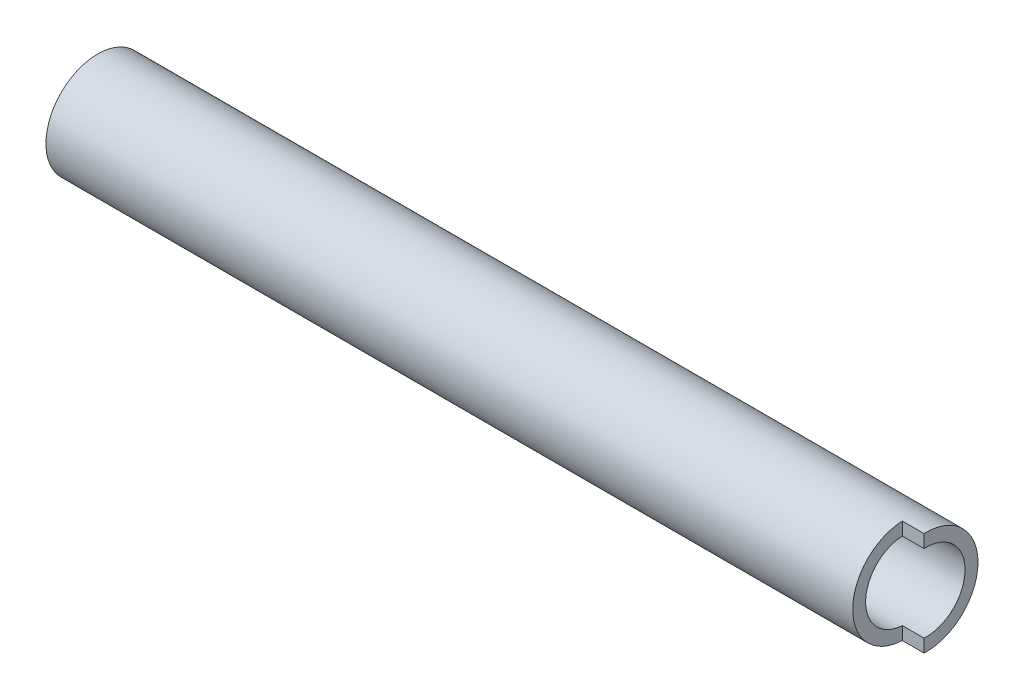
ISO-10303-21;
HEADER;
FILE_DESCRIPTION(('STEP AP214'),'2;1');
FILE_NAME('part.step','',(''),(''),'','','');
FILE_SCHEMA(('AUTOMOTIVE_DESIGN { 1 0 10303 214 1 1 1 1 }'));
ENDSEC;
DATA;
#1=APPLICATION_CONTEXT('core data for automotive mechanical design processes');
#2=APPLICATION_PROTOCOL_DEFINITION('international standard','automotive_design',2000,#1);
#3=PRODUCT_CONTEXT('',#1,'mechanical');
#4=PRODUCT('Part','Part','',(#3));
#5=PRODUCT_RELATED_PRODUCT_CATEGORY('part','',(#4));
#6=PRODUCT_DEFINITION_FORMATION('','',#4);
#7=PRODUCT_DEFINITION_CONTEXT('part definition',#1,'design');
#8=PRODUCT_DEFINITION('design','',#6,#7);
#9=PRODUCT_DEFINITION_SHAPE('','',#8);
#10=(LENGTH_UNIT() NAMED_UNIT(*) SI_UNIT(.MILLI.,.METRE.));
#11=(NAMED_UNIT(*) PLANE_ANGLE_UNIT() SI_UNIT($,.RADIAN.));
#12=(NAMED_UNIT(*) SI_UNIT($,.STERADIAN.) SOLID_ANGLE_UNIT());
#13=UNCERTAINTY_MEASURE_WITH_UNIT(LENGTH_MEASURE(1.E-05),#10,'distance_accuracy_value','');
#14=(GEOMETRIC_REPRESENTATION_CONTEXT(3) GLOBAL_UNCERTAINTY_ASSIGNED_CONTEXT((#13)) GLOBAL_UNIT_ASSIGNED_CONTEXT((#10,
#11,#12)) REPRESENTATION_CONTEXT('',''));
#15=CARTESIAN_POINT('',(0.,0.,0.));
#16=DIRECTION('',(0.,0.,1.));
#17=DIRECTION('',(1.,0.,0.));
#18=AXIS2_PLACEMENT_3D('',#15,#16,#17);
#19=CARTESIAN_POINT('',(38.1,0.,0.));
#20=DIRECTION('',(1.,0.,0.));
#21=DIRECTION('',(0.,0.,-1.));
#22=AXIS2_PLACEMENT_3D('',#19,#20,#21);
#23=PLANE('',#22);
#24=DIRECTION('',(0.,1.,0.));
#25=VECTOR('',#24,1.);
#26=CARTESIAN_POINT('',(38.1,0.,0.201999999993971));
#27=LINE('',#26,#25);
#28=CARTESIAN_POINT('',(38.1,-4.75821418706666,0.201999999993971));
#29=VERTEX_POINT('',#28);
#30=CARTESIAN_POINT('',(38.1,-3.56615857970834,0.201999999993971));
#31=VERTEX_POINT('',#30);
#32=EDGE_CURVE('E84',#29,#31,#27,.T.);
#33=ORIENTED_EDGE('',*,*,#32,.F.);
#34=CARTESIAN_POINT('',(38.1,0.,0.));
#35=DIRECTION('',(1.,0.,0.));
#36=DIRECTION('',(0.,0.,-1.));
#37=AXIS2_PLACEMENT_3D('',#34,#35,#36);
#38=CIRCLE('',#37,4.7625);
#39=CARTESIAN_POINT('',(38.1,4.75821418706666,0.201999999993971));
#40=VERTEX_POINT('',#39);
#41=EDGE_CURVE('E105',#29,#40,#38,.T.);
#42=ORIENTED_EDGE('',*,*,#41,.T.);
#43=CARTESIAN_POINT('',(38.1,3.56615857970834,0.201999999993971));
#44=VERTEX_POINT('',#43);
#45=EDGE_CURVE('E79',#44,#40,#27,.T.);
#46=ORIENTED_EDGE('',*,*,#45,.F.);
#47=CARTESIAN_POINT('',(38.1,0.,0.));
#48=DIRECTION('',(1.,0.,0.));
#49=DIRECTION('',(0.,0.,-1.));
#50=AXIS2_PLACEMENT_3D('',#47,#48,#49);
#51=CIRCLE('',#50,3.571875);
#52=EDGE_CURVE('E98',#31,#44,#51,.T.);
#53=ORIENTED_EDGE('',*,*,#52,.F.);
#54=EDGE_LOOP('',(#33,#42,#46,#53));
#55=FACE_BOUND('',#54,.T.);
#56=ADVANCED_FACE('F37',(#55),#23,.T.);
#57=CARTESIAN_POINT('',(-38.1,0.,0.));
#58=DIRECTION('',(1.,0.,0.));
#59=DIRECTION('',(0.,0.,-1.));
#60=AXIS2_PLACEMENT_3D('',#57,#58,#59);
#61=PLANE('',#60);
#62=CARTESIAN_POINT('',(-38.1,0.,0.));
#63=DIRECTION('',(1.,0.,0.));
#64=DIRECTION('',(0.,0.,-1.));
#65=AXIS2_PLACEMENT_3D('',#62,#63,#64);
#66=CIRCLE('',#65,4.7625);
#67=CARTESIAN_POINT('',(-38.1,0.,-4.7625));
#68=VERTEX_POINT('',#67);
#69=EDGE_CURVE('E103',#68,#68,#66,.T.);
#70=ORIENTED_EDGE('',*,*,#69,.F.);
#71=EDGE_LOOP('',(#70));
#72=FACE_BOUND('',#71,.T.);
#73=CARTESIAN_POINT('',(-38.1,0.,0.));
#74=DIRECTION('',(1.,0.,0.));
#75=DIRECTION('',(0.,0.,-1.));
#76=AXIS2_PLACEMENT_3D('',#73,#74,#75);
#77=CIRCLE('',#76,3.571875);
#78=CARTESIAN_POINT('',(-38.1,0.,-3.571875));
#79=VERTEX_POINT('',#78);
#80=EDGE_CURVE('E95',#79,#79,#77,.T.);
#81=ORIENTED_EDGE('',*,*,#80,.T.);
#82=EDGE_LOOP('',(#81));
#83=FACE_BOUND('',#82,.T.);
#84=ADVANCED_FACE('F126',(#72,#83),#61,.F.);
#85=CARTESIAN_POINT('',(38.1,0.,0.));
#86=DIRECTION('',(-1.,0.,0.));
#87=DIRECTION('',(0.,0.,1.));
#88=AXIS2_PLACEMENT_3D('',#85,#86,#87);
#89=CYLINDRICAL_SURFACE('',#88,4.7625);
#90=ORIENTED_EDGE('',*,*,#41,.F.);
#91=DIRECTION('',(-1.,0.,0.));
#92=VECTOR('',#91,1.);
#93=CARTESIAN_POINT('',(38.1,-4.75821418706666,0.201999999993971));
#94=LINE('',#93,#92);
#95=CARTESIAN_POINT('',(36.1000000000001,-4.75821418706666,0.201999999993971));
#96=VERTEX_POINT('',#95);
#97=EDGE_CURVE('E60',#29,#96,#94,.T.);
#98=ORIENTED_EDGE('',*,*,#97,.T.);
#99=CARTESIAN_POINT('',(36.1000000000001,0.,0.));
#100=DIRECTION('',(-1.,0.,0.));
#101=DIRECTION('',(0.,0.,1.));
#102=AXIS2_PLACEMENT_3D('',#99,#100,#101);
#103=CIRCLE('',#102,4.7625);
#104=CARTESIAN_POINT('',(36.1000000000001,4.75821418706666,0.201999999993971));
#105=VERTEX_POINT('',#104);
#106=EDGE_CURVE('E89',#96,#105,#103,.T.);
#107=ORIENTED_EDGE('',*,*,#106,.T.);
#108=DIRECTION('',(-1.,0.,0.));
#109=VECTOR('',#108,1.);
#110=CARTESIAN_POINT('',(38.1,4.75821418706666,0.201999999993971));
#111=LINE('',#110,#109);
#112=EDGE_CURVE('E76',#105,#40,#111,.F.);
#113=ORIENTED_EDGE('',*,*,#112,.T.);
#114=EDGE_LOOP('',(#90,#98,#107,#113));
#115=FACE_BOUND('',#114,.T.);
#116=ORIENTED_EDGE('',*,*,#69,.T.);
#117=EDGE_LOOP('',(#116));
#118=FACE_BOUND('',#117,.T.);
#119=ADVANCED_FACE('F39',(#115,#118),#89,.T.);
#120=CARTESIAN_POINT('',(38.1,0.,0.));
#121=DIRECTION('',(-1.,0.,0.));
#122=DIRECTION('',(0.,0.,1.));
#123=AXIS2_PLACEMENT_3D('',#120,#121,#122);
#124=CYLINDRICAL_SURFACE('',#123,3.571875);
#125=DIRECTION('',(-1.,0.,0.));
#126=VECTOR('',#125,1.);
#127=CARTESIAN_POINT('',(38.1,-3.56615857970834,0.201999999993971));
#128=LINE('',#127,#126);
#129=CARTESIAN_POINT('',(36.1000000000001,-3.56615857970834,0.201999999993971));
#130=VERTEX_POINT('',#129);
#131=EDGE_CURVE('E11',#31,#130,#128,.T.);
#132=ORIENTED_EDGE('',*,*,#131,.F.);
#133=ORIENTED_EDGE('',*,*,#52,.T.);
#134=DIRECTION('',(-1.,0.,0.));
#135=VECTOR('',#134,1.);
#136=CARTESIAN_POINT('',(38.1,3.56615857970834,0.201999999993971));
#137=LINE('',#136,#135);
#138=CARTESIAN_POINT('',(36.1000000000001,3.56615857970834,0.201999999993971));
#139=VERTEX_POINT('',#138);
#140=EDGE_CURVE('E107',#139,#44,#137,.F.);
#141=ORIENTED_EDGE('',*,*,#140,.F.);
#142=CARTESIAN_POINT('',(36.1000000000001,0.,0.));
#143=DIRECTION('',(-1.,0.,0.));
#144=DIRECTION('',(0.,0.,1.));
#145=AXIS2_PLACEMENT_3D('',#142,#143,#144);
#146=CIRCLE('',#145,3.571875);
#147=EDGE_CURVE('E45',#130,#139,#146,.T.);
#148=ORIENTED_EDGE('',*,*,#147,.F.);
#149=EDGE_LOOP('',(#132,#133,#141,#148));
#150=FACE_BOUND('',#149,.T.);
#151=ORIENTED_EDGE('',*,*,#80,.F.);
#152=EDGE_LOOP('',(#151));
#153=FACE_BOUND('',#152,.T.);
#154=ADVANCED_FACE('F115',(#150,#153),#124,.F.);
#155=CARTESIAN_POINT('',(36.1000000000001,-5.73209010394164,0.201999999993971));
#156=DIRECTION('',(-1.,0.,0.));
#157=DIRECTION('',(0.,0.,1.));
#158=AXIS2_PLACEMENT_3D('',#155,#156,#157);
#159=PLANE('',#158);
#160=DIRECTION('',(0.,-1.,0.));
#161=VECTOR('',#160,1.);
#162=CARTESIAN_POINT('',(36.1000000000001,-5.73209010394164,0.201999999993971));
#163=LINE('',#162,#161);
#164=EDGE_CURVE('E92',#130,#96,#163,.T.);
#165=ORIENTED_EDGE('',*,*,#164,.F.);
#166=ORIENTED_EDGE('',*,*,#147,.T.);
#167=EDGE_CURVE('E52',#105,#139,#163,.T.);
#168=ORIENTED_EDGE('',*,*,#167,.F.);
#169=ORIENTED_EDGE('',*,*,#106,.F.);
#170=EDGE_LOOP('',(#165,#166,#168,#169));
#171=FACE_BOUND('',#170,.T.);
#172=ADVANCED_FACE('F88',(#171),#159,.F.);
#173=CARTESIAN_POINT('',(0.,0.,0.201999999993971));
#174=DIRECTION('',(0.,0.,-1.));
#175=DIRECTION('',(-1.,0.,0.));
#176=AXIS2_PLACEMENT_3D('',#173,#174,#175);
#177=PLANE('',#176);
#178=ORIENTED_EDGE('',*,*,#32,.T.);
#179=ORIENTED_EDGE('',*,*,#131,.T.);
#180=ORIENTED_EDGE('',*,*,#164,.T.);
#181=ORIENTED_EDGE('',*,*,#97,.F.);
#182=EDGE_LOOP('',(#178,#179,#180,#181));
#183=FACE_BOUND('',#182,.T.);
#184=ADVANCED_FACE('F117',(#183),#177,.F.);
#185=ORIENTED_EDGE('',*,*,#167,.T.);
#186=ORIENTED_EDGE('',*,*,#140,.T.);
#187=ORIENTED_EDGE('',*,*,#45,.T.);
#188=ORIENTED_EDGE('',*,*,#112,.F.);
#189=EDGE_LOOP('',(#185,#186,#187,#188));
#190=FACE_BOUND('',#189,.T.);
#191=ADVANCED_FACE('F77',(#190),#177,.F.);
#192=CLOSED_SHELL('',(#56,#84,#119,#154,#172,#184,#191));
#193=MANIFOLD_SOLID_BREP('B2',#192);
#194=ADVANCED_BREP_SHAPE_REPRESENTATION('',(#18,#193),#14);
#195=SHAPE_DEFINITION_REPRESENTATION(#9,#194);
ENDSEC;
END-ISO-10303-21;
